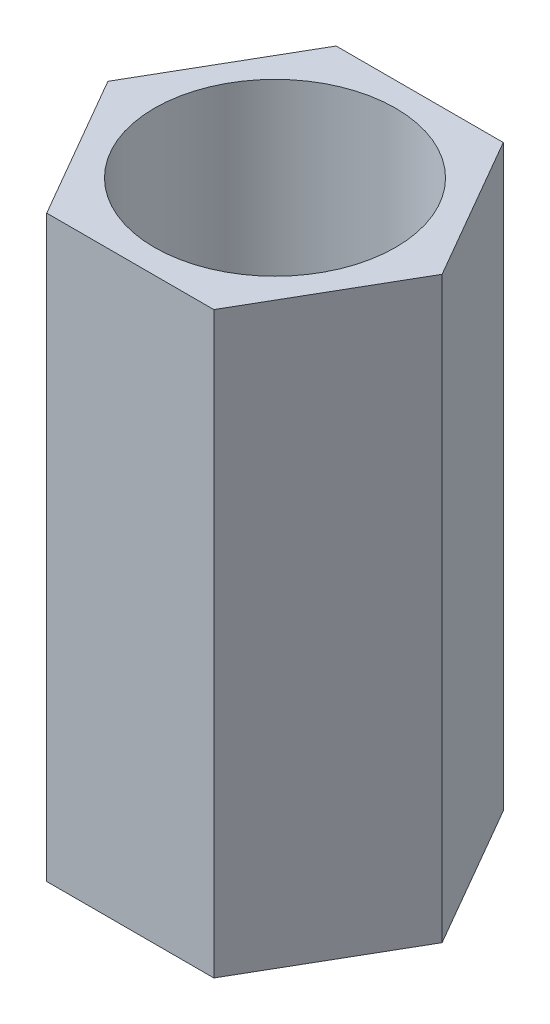
ISO-10303-21;
HEADER;
FILE_DESCRIPTION(('STEP AP214'),'2;1');
FILE_NAME('part.step','',(''),(''),'','','');
FILE_SCHEMA(('AUTOMOTIVE_DESIGN { 1 0 10303 214 1 1 1 1 }'));
ENDSEC;
DATA;
#1=APPLICATION_CONTEXT('core data for automotive mechanical design processes');
#2=APPLICATION_PROTOCOL_DEFINITION('international standard','automotive_design',2000,#1);
#3=PRODUCT_CONTEXT('',#1,'mechanical');
#4=PRODUCT('Part','Part','',(#3));
#5=PRODUCT_RELATED_PRODUCT_CATEGORY('part','',(#4));
#6=PRODUCT_DEFINITION_FORMATION('','',#4);
#7=PRODUCT_DEFINITION_CONTEXT('part definition',#1,'design');
#8=PRODUCT_DEFINITION('design','',#6,#7);
#9=PRODUCT_DEFINITION_SHAPE('','',#8);
#10=(LENGTH_UNIT() NAMED_UNIT(*) SI_UNIT(.MILLI.,.METRE.));
#11=(NAMED_UNIT(*) PLANE_ANGLE_UNIT() SI_UNIT($,.RADIAN.));
#12=(NAMED_UNIT(*) SI_UNIT($,.STERADIAN.) SOLID_ANGLE_UNIT());
#13=UNCERTAINTY_MEASURE_WITH_UNIT(LENGTH_MEASURE(1.E-05),#10,'distance_accuracy_value','');
#14=(GEOMETRIC_REPRESENTATION_CONTEXT(3) GLOBAL_UNCERTAINTY_ASSIGNED_CONTEXT((#13)) GLOBAL_UNIT_ASSIGNED_CONTEXT((#10,
#11,#12)) REPRESENTATION_CONTEXT('',''));
#15=CARTESIAN_POINT('',(0.,0.,0.));
#16=DIRECTION('',(0.,0.,1.));
#17=DIRECTION('',(1.,0.,0.));
#18=AXIS2_PLACEMENT_3D('',#15,#16,#17);
#19=CARTESIAN_POINT('',(0.,6.,0.));
#20=DIRECTION('',(0.,1.,0.));
#21=DIRECTION('',(0.,0.,1.));
#22=AXIS2_PLACEMENT_3D('',#19,#20,#21);
#23=PLANE('',#22);
#24=DIRECTION('',(1.,0.,0.));
#25=VECTOR('',#24,1.);
#26=CARTESIAN_POINT('',(-0.866025403784439,6.,1.5));
#27=LINE('',#26,#25);
#28=CARTESIAN_POINT('',(-0.866025403784439,6.,1.5));
#29=VERTEX_POINT('',#28);
#30=CARTESIAN_POINT('',(0.866025403784438,6.,1.5));
#31=VERTEX_POINT('',#30);
#32=EDGE_CURVE('E129',#29,#31,#27,.T.);
#33=ORIENTED_EDGE('',*,*,#32,.T.);
#34=DIRECTION('',(0.5,0.,-0.866025403784439));
#35=VECTOR('',#34,1.);
#36=CARTESIAN_POINT('',(0.866025403784438,6.,1.5));
#37=LINE('',#36,#35);
#38=CARTESIAN_POINT('',(1.73205080756888,6.,0.));
#39=VERTEX_POINT('',#38);
#40=EDGE_CURVE('E87',#31,#39,#37,.T.);
#41=ORIENTED_EDGE('',*,*,#40,.T.);
#42=DIRECTION('',(-0.5,0.,-0.866025403784439));
#43=VECTOR('',#42,1.);
#44=CARTESIAN_POINT('',(1.73205080756888,6.,0.));
#45=LINE('',#44,#43);
#46=CARTESIAN_POINT('',(0.866025403784437,6.,-1.5));
#47=VERTEX_POINT('',#46);
#48=EDGE_CURVE('E100',#39,#47,#45,.T.);
#49=ORIENTED_EDGE('',*,*,#48,.T.);
#50=DIRECTION('',(-1.,0.,0.));
#51=VECTOR('',#50,1.);
#52=CARTESIAN_POINT('',(0.866025403784437,6.,-1.5));
#53=LINE('',#52,#51);
#54=CARTESIAN_POINT('',(-0.866025403784439,6.,-1.5));
#55=VERTEX_POINT('',#54);
#56=EDGE_CURVE('E94',#47,#55,#53,.T.);
#57=ORIENTED_EDGE('',*,*,#56,.T.);
#58=DIRECTION('',(-0.5,0.,0.866025403784439));
#59=VECTOR('',#58,1.);
#60=CARTESIAN_POINT('',(-0.866025403784439,6.,-1.5));
#61=LINE('',#60,#59);
#62=CARTESIAN_POINT('',(-1.73205080756888,6.,0.));
#63=VERTEX_POINT('',#62);
#64=EDGE_CURVE('E98',#55,#63,#61,.T.);
#65=ORIENTED_EDGE('',*,*,#64,.T.);
#66=DIRECTION('',(0.5,0.,0.866025403784439));
#67=VECTOR('',#66,1.);
#68=CARTESIAN_POINT('',(-1.73205080756888,6.,0.));
#69=LINE('',#68,#67);
#70=EDGE_CURVE('E50',#63,#29,#69,.T.);
#71=ORIENTED_EDGE('',*,*,#70,.T.);
#72=EDGE_LOOP('',(#33,#41,#49,#57,#65,#71));
#73=FACE_BOUND('',#72,.T.);
#74=CARTESIAN_POINT('',(0.,6.,0.));
#75=DIRECTION('',(0.,1.,0.));
#76=DIRECTION('',(0.,0.,1.));
#77=AXIS2_PLACEMENT_3D('',#74,#75,#76);
#78=CIRCLE('',#77,1.25);
#79=CARTESIAN_POINT('',(0.,6.,1.25));
#80=VERTEX_POINT('',#79);
#81=EDGE_CURVE('E122',#80,#80,#78,.T.);
#82=ORIENTED_EDGE('',*,*,#81,.F.);
#83=EDGE_LOOP('',(#82));
#84=FACE_BOUND('',#83,.T.);
#85=ADVANCED_FACE('F33',(#73,#84),#23,.T.);
#86=CARTESIAN_POINT('',(0.,0.,0.));
#87=DIRECTION('',(0.,1.,0.));
#88=DIRECTION('',(0.,0.,1.));
#89=AXIS2_PLACEMENT_3D('',#86,#87,#88);
#90=PLANE('',#89);
#91=DIRECTION('',(1.,0.,0.));
#92=VECTOR('',#91,1.);
#93=CARTESIAN_POINT('',(-0.866025403784439,0.,1.5));
#94=LINE('',#93,#92);
#95=CARTESIAN_POINT('',(-0.866025403784439,0.,1.5));
#96=VERTEX_POINT('',#95);
#97=CARTESIAN_POINT('',(0.866025403784438,0.,1.5));
#98=VERTEX_POINT('',#97);
#99=EDGE_CURVE('E118',#96,#98,#94,.T.);
#100=ORIENTED_EDGE('',*,*,#99,.F.);
#101=DIRECTION('',(0.5,0.,0.866025403784439));
#102=VECTOR('',#101,1.);
#103=CARTESIAN_POINT('',(-1.73205080756888,0.,0.));
#104=LINE('',#103,#102);
#105=CARTESIAN_POINT('',(-1.73205080756888,0.,0.));
#106=VERTEX_POINT('',#105);
#107=EDGE_CURVE('E79',#106,#96,#104,.T.);
#108=ORIENTED_EDGE('',*,*,#107,.F.);
#109=DIRECTION('',(-0.5,0.,0.866025403784439));
#110=VECTOR('',#109,1.);
#111=CARTESIAN_POINT('',(-0.866025403784439,0.,-1.5));
#112=LINE('',#111,#110);
#113=CARTESIAN_POINT('',(-0.866025403784439,0.,-1.5));
#114=VERTEX_POINT('',#113);
#115=EDGE_CURVE('E73',#114,#106,#112,.T.);
#116=ORIENTED_EDGE('',*,*,#115,.F.);
#117=DIRECTION('',(-1.,0.,0.));
#118=VECTOR('',#117,1.);
#119=CARTESIAN_POINT('',(0.866025403784437,0.,-1.5));
#120=LINE('',#119,#118);
#121=CARTESIAN_POINT('',(0.866025403784437,0.,-1.5));
#122=VERTEX_POINT('',#121);
#123=EDGE_CURVE('E108',#122,#114,#120,.T.);
#124=ORIENTED_EDGE('',*,*,#123,.F.);
#125=DIRECTION('',(-0.5,0.,-0.866025403784439));
#126=VECTOR('',#125,1.);
#127=CARTESIAN_POINT('',(1.73205080756888,0.,0.));
#128=LINE('',#127,#126);
#129=CARTESIAN_POINT('',(1.73205080756888,0.,0.));
#130=VERTEX_POINT('',#129);
#131=EDGE_CURVE('E124',#130,#122,#128,.T.);
#132=ORIENTED_EDGE('',*,*,#131,.F.);
#133=DIRECTION('',(0.5,0.,-0.866025403784439));
#134=VECTOR('',#133,1.);
#135=CARTESIAN_POINT('',(0.866025403784438,0.,1.5));
#136=LINE('',#135,#134);
#137=EDGE_CURVE('E121',#98,#130,#136,.T.);
#138=ORIENTED_EDGE('',*,*,#137,.F.);
#139=EDGE_LOOP('',(#100,#108,#116,#124,#132,#138));
#140=FACE_BOUND('',#139,.T.);
#141=CARTESIAN_POINT('',(0.,0.,0.));
#142=DIRECTION('',(0.,1.,0.));
#143=DIRECTION('',(0.,0.,1.));
#144=AXIS2_PLACEMENT_3D('',#141,#142,#143);
#145=CIRCLE('',#144,1.25);
#146=CARTESIAN_POINT('',(0.,0.,1.25));
#147=VERTEX_POINT('',#146);
#148=EDGE_CURVE('E222',#147,#147,#145,.T.);
#149=ORIENTED_EDGE('',*,*,#148,.T.);
#150=EDGE_LOOP('',(#149));
#151=FACE_BOUND('',#150,.T.);
#152=ADVANCED_FACE('F138',(#140,#151),#90,.F.);
#153=CARTESIAN_POINT('',(-0.866025403784439,6.,1.5));
#154=DIRECTION('',(0.,0.,-1.));
#155=DIRECTION('',(-1.,0.,0.));
#156=AXIS2_PLACEMENT_3D('',#153,#154,#155);
#157=PLANE('',#156);
#158=ORIENTED_EDGE('',*,*,#99,.T.);
#159=DIRECTION('',(0.,-1.,0.));
#160=VECTOR('',#159,1.);
#161=CARTESIAN_POINT('',(0.866025403784438,6.,1.5));
#162=LINE('',#161,#160);
#163=EDGE_CURVE('E11',#31,#98,#162,.T.);
#164=ORIENTED_EDGE('',*,*,#163,.F.);
#165=ORIENTED_EDGE('',*,*,#32,.F.);
#166=DIRECTION('',(0.,-1.,0.));
#167=VECTOR('',#166,1.);
#168=CARTESIAN_POINT('',(-0.866025403784439,6.,1.5));
#169=LINE('',#168,#167);
#170=EDGE_CURVE('E114',#29,#96,#169,.T.);
#171=ORIENTED_EDGE('',*,*,#170,.T.);
#172=EDGE_LOOP('',(#158,#164,#165,#171));
#173=FACE_BOUND('',#172,.T.);
#174=ADVANCED_FACE('F35',(#173),#157,.F.);
#175=CARTESIAN_POINT('',(0.866025403784438,6.,1.5));
#176=DIRECTION('',(-0.866025403784438,0.,-0.5));
#177=DIRECTION('',(-0.5,0.,0.866025403784439));
#178=AXIS2_PLACEMENT_3D('',#175,#176,#177);
#179=PLANE('',#178);
#180=ORIENTED_EDGE('',*,*,#137,.T.);
#181=DIRECTION('',(0.,-1.,0.));
#182=VECTOR('',#181,1.);
#183=CARTESIAN_POINT('',(1.73205080756888,6.,0.));
#184=LINE('',#183,#182);
#185=EDGE_CURVE('E42',#39,#130,#184,.T.);
#186=ORIENTED_EDGE('',*,*,#185,.F.);
#187=ORIENTED_EDGE('',*,*,#40,.F.);
#188=ORIENTED_EDGE('',*,*,#163,.T.);
#189=EDGE_LOOP('',(#180,#186,#187,#188));
#190=FACE_BOUND('',#189,.T.);
#191=ADVANCED_FACE('F163',(#190),#179,.F.);
#192=CARTESIAN_POINT('',(1.73205080756888,6.,0.));
#193=DIRECTION('',(-0.866025403784439,0.,0.5));
#194=DIRECTION('',(0.5,0.,0.866025403784439));
#195=AXIS2_PLACEMENT_3D('',#192,#193,#194);
#196=PLANE('',#195);
#197=ORIENTED_EDGE('',*,*,#131,.T.);
#198=DIRECTION('',(0.,-1.,0.));
#199=VECTOR('',#198,1.);
#200=CARTESIAN_POINT('',(0.866025403784437,6.,-1.5));
#201=LINE('',#200,#199);
#202=EDGE_CURVE('E109',#47,#122,#201,.T.);
#203=ORIENTED_EDGE('',*,*,#202,.F.);
#204=ORIENTED_EDGE('',*,*,#48,.F.);
#205=ORIENTED_EDGE('',*,*,#185,.T.);
#206=EDGE_LOOP('',(#197,#203,#204,#205));
#207=FACE_BOUND('',#206,.T.);
#208=ADVANCED_FACE('F135',(#207),#196,.F.);
#209=CARTESIAN_POINT('',(0.866025403784437,6.,-1.5));
#210=DIRECTION('',(0.,0.,1.));
#211=DIRECTION('',(1.,0.,0.));
#212=AXIS2_PLACEMENT_3D('',#209,#210,#211);
#213=PLANE('',#212);
#214=ORIENTED_EDGE('',*,*,#123,.T.);
#215=DIRECTION('',(0.,-1.,0.));
#216=VECTOR('',#215,1.);
#217=CARTESIAN_POINT('',(-0.866025403784439,6.,-1.5));
#218=LINE('',#217,#216);
#219=EDGE_CURVE('E105',#55,#114,#218,.T.);
#220=ORIENTED_EDGE('',*,*,#219,.F.);
#221=ORIENTED_EDGE('',*,*,#56,.F.);
#222=ORIENTED_EDGE('',*,*,#202,.T.);
#223=EDGE_LOOP('',(#214,#220,#221,#222));
#224=FACE_BOUND('',#223,.T.);
#225=ADVANCED_FACE('F106',(#224),#213,.F.);
#226=CARTESIAN_POINT('',(-0.866025403784439,6.,-1.5));
#227=DIRECTION('',(0.866025403784439,0.,0.5));
#228=DIRECTION('',(0.5,0.,-0.866025403784439));
#229=AXIS2_PLACEMENT_3D('',#226,#227,#228);
#230=PLANE('',#229);
#231=ORIENTED_EDGE('',*,*,#115,.T.);
#232=DIRECTION('',(0.,-1.,0.));
#233=VECTOR('',#232,1.);
#234=CARTESIAN_POINT('',(-1.73205080756888,6.,0.));
#235=LINE('',#234,#233);
#236=EDGE_CURVE('E110',#63,#106,#235,.T.);
#237=ORIENTED_EDGE('',*,*,#236,.F.);
#238=ORIENTED_EDGE('',*,*,#64,.F.);
#239=ORIENTED_EDGE('',*,*,#219,.T.);
#240=EDGE_LOOP('',(#231,#237,#238,#239));
#241=FACE_BOUND('',#240,.T.);
#242=ADVANCED_FACE('F112',(#241),#230,.F.);
#243=CARTESIAN_POINT('',(-1.73205080756888,6.,0.));
#244=DIRECTION('',(0.866025403784439,0.,-0.5));
#245=DIRECTION('',(-0.5,0.,-0.866025403784439));
#246=AXIS2_PLACEMENT_3D('',#243,#244,#245);
#247=PLANE('',#246);
#248=ORIENTED_EDGE('',*,*,#107,.T.);
#249=ORIENTED_EDGE('',*,*,#170,.F.);
#250=ORIENTED_EDGE('',*,*,#70,.F.);
#251=ORIENTED_EDGE('',*,*,#236,.T.);
#252=EDGE_LOOP('',(#248,#249,#250,#251));
#253=FACE_BOUND('',#252,.T.);
#254=ADVANCED_FACE('F143',(#253),#247,.F.);
#255=CARTESIAN_POINT('',(0.,6.,0.));
#256=DIRECTION('',(0.,-1.,0.));
#257=DIRECTION('',(0.,0.,-1.));
#258=AXIS2_PLACEMENT_3D('',#255,#256,#257);
#259=CYLINDRICAL_SURFACE('',#258,1.25);
#260=ORIENTED_EDGE('',*,*,#81,.T.);
#261=EDGE_LOOP('',(#260));
#262=FACE_BOUND('',#261,.T.);
#263=ORIENTED_EDGE('',*,*,#148,.F.);
#264=EDGE_LOOP('',(#263));
#265=FACE_BOUND('',#264,.T.);
#266=ADVANCED_FACE('F145',(#262,#265),#259,.F.);
#267=CLOSED_SHELL('',(#85,#152,#174,#191,#208,#225,#242,#254,#266));
#268=MANIFOLD_SOLID_BREP('B2',#267);
#269=ADVANCED_BREP_SHAPE_REPRESENTATION('',(#18,#268),#14);
#270=SHAPE_DEFINITION_REPRESENTATION(#9,#269);
ENDSEC;
END-ISO-10303-21;
